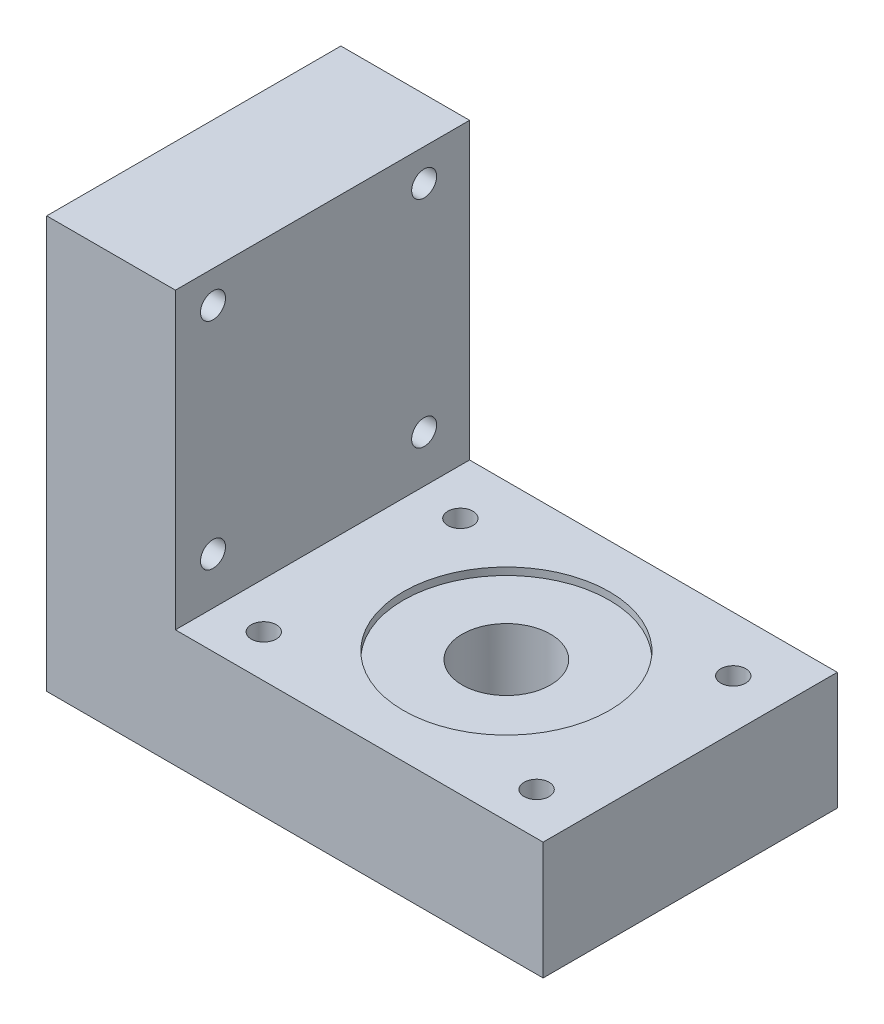
ISO-10303-21;
HEADER;
FILE_DESCRIPTION(('STEP AP214'),'2;1');
FILE_NAME('part.step','',(''),(''),'','','');
FILE_SCHEMA(('AUTOMOTIVE_DESIGN { 1 0 10303 214 1 1 1 1 }'));
ENDSEC;
DATA;
#1=APPLICATION_CONTEXT('core data for automotive mechanical design processes');
#2=APPLICATION_PROTOCOL_DEFINITION('international standard','automotive_design',2000,#1);
#3=PRODUCT_CONTEXT('',#1,'mechanical');
#4=PRODUCT('Part','Part','',(#3));
#5=PRODUCT_RELATED_PRODUCT_CATEGORY('part','',(#4));
#6=PRODUCT_DEFINITION_FORMATION('','',#4);
#7=PRODUCT_DEFINITION_CONTEXT('part definition',#1,'design');
#8=PRODUCT_DEFINITION('design','',#6,#7);
#9=PRODUCT_DEFINITION_SHAPE('','',#8);
#10=(LENGTH_UNIT() NAMED_UNIT(*) SI_UNIT(.MILLI.,.METRE.));
#11=(NAMED_UNIT(*) PLANE_ANGLE_UNIT() SI_UNIT($,.RADIAN.));
#12=(NAMED_UNIT(*) SI_UNIT($,.STERADIAN.) SOLID_ANGLE_UNIT());
#13=UNCERTAINTY_MEASURE_WITH_UNIT(LENGTH_MEASURE(1.E-05),#10,'distance_accuracy_value','');
#14=(GEOMETRIC_REPRESENTATION_CONTEXT(3) GLOBAL_UNCERTAINTY_ASSIGNED_CONTEXT((#13)) GLOBAL_UNIT_ASSIGNED_CONTEXT((#10,
#11,#12)) REPRESENTATION_CONTEXT('',''));
#15=CARTESIAN_POINT('',(0.,0.,0.));
#16=DIRECTION('',(0.,0.,1.));
#17=DIRECTION('',(1.,0.,0.));
#18=AXIS2_PLACEMENT_3D('',#15,#16,#17);
#19=CARTESIAN_POINT('',(42500.,-0.0009999999992516,20000.));
#20=DIRECTION('',(0.,1.,0.));
#21=DIRECTION('',(0.,0.,1.));
#22=AXIS2_PLACEMENT_3D('',#19,#20,#21);
#23=CYLINDRICAL_SURFACE('',#22,6000.);
#24=CARTESIAN_POINT('',(42500.,0.,20000.));
#25=DIRECTION('',(0.,1.,0.));
#26=DIRECTION('',(0.,0.,1.));
#27=AXIS2_PLACEMENT_3D('',#24,#25,#26);
#28=CIRCLE('',#27,6000.);
#29=CARTESIAN_POINT('',(42500.,0.,26000.));
#30=VERTEX_POINT('',#29);
#31=EDGE_CURVE('E132',#30,#30,#28,.F.);
#32=ORIENTED_EDGE('',*,*,#31,.T.);
#33=EDGE_LOOP('',(#32));
#34=FACE_BOUND('',#33,.T.);
#35=CARTESIAN_POINT('',(42500.,15000.,20000.));
#36=DIRECTION('',(0.,1.,0.));
#37=DIRECTION('',(-1.,0.,0.));
#38=AXIS2_PLACEMENT_3D('',#35,#36,#37);
#39=CIRCLE('',#38,6000.);
#40=CARTESIAN_POINT('',(36500.,15000.,20000.));
#41=VERTEX_POINT('',#40);
#42=EDGE_CURVE('E50',#41,#41,#39,.F.);
#43=ORIENTED_EDGE('',*,*,#42,.F.);
#44=EDGE_LOOP('',(#43));
#45=FACE_BOUND('',#44,.T.);
#46=ADVANCED_FACE('F43',(#34,#45),#23,.F.);
#47=CARTESIAN_POINT('',(17500.,56000.,40000.));
#48=DIRECTION('',(0.,-1.,0.));
#49=DIRECTION('',(0.,0.,-1.));
#50=AXIS2_PLACEMENT_3D('',#47,#48,#49);
#51=PLANE('',#50);
#52=DIRECTION('',(-1.,0.,0.));
#53=VECTOR('',#52,1.);
#54=CARTESIAN_POINT('',(17500.,56000.,0.));
#55=LINE('',#54,#53);
#56=CARTESIAN_POINT('',(17500.,56000.,0.));
#57=VERTEX_POINT('',#56);
#58=CARTESIAN_POINT('',(-1.95943487863576E-12,56000.,0.));
#59=VERTEX_POINT('',#58);
#60=EDGE_CURVE('E129',#57,#59,#55,.T.);
#61=ORIENTED_EDGE('',*,*,#60,.T.);
#62=DIRECTION('',(0.,0.,-1.));
#63=VECTOR('',#62,1.);
#64=CARTESIAN_POINT('',(-1.95943487863576E-12,56000.,40000.));
#65=LINE('',#64,#63);
#66=CARTESIAN_POINT('',(-1.95943487863576E-12,56000.,40000.));
#67=VERTEX_POINT('',#66);
#68=EDGE_CURVE('E11',#67,#59,#65,.T.);
#69=ORIENTED_EDGE('',*,*,#68,.F.);
#70=DIRECTION('',(-1.,0.,0.));
#71=VECTOR('',#70,1.);
#72=CARTESIAN_POINT('',(17500.,56000.,40000.));
#73=LINE('',#72,#71);
#74=CARTESIAN_POINT('',(17500.,56000.,40000.));
#75=VERTEX_POINT('',#74);
#76=EDGE_CURVE('E138',#75,#67,#73,.T.);
#77=ORIENTED_EDGE('',*,*,#76,.F.);
#78=DIRECTION('',(0.,0.,-1.));
#79=VECTOR('',#78,1.);
#80=CARTESIAN_POINT('',(17500.,56000.,40000.));
#81=LINE('',#80,#79);
#82=EDGE_CURVE('E123',#75,#57,#81,.T.);
#83=ORIENTED_EDGE('',*,*,#82,.T.);
#84=EDGE_LOOP('',(#61,#69,#77,#83));
#85=FACE_BOUND('',#84,.T.);
#86=ADVANCED_FACE('F44',(#85),#51,.F.);
#87=CARTESIAN_POINT('',(-1.95943487863576E-12,56000.,40000.));
#88=DIRECTION('',(1.,0.,0.));
#89=DIRECTION('',(0.,1.,0.));
#90=AXIS2_PLACEMENT_3D('',#87,#88,#89);
#91=PLANE('',#90);
#92=CARTESIAN_POINT('',(-1.80748762955245E-12,51657.3945870796,6177.40458756636));
#93=DIRECTION('',(1.,0.,0.));
#94=DIRECTION('',(0.,1.,0.));
#95=AXIS2_PLACEMENT_3D('',#92,#93,#94);
#96=CIRCLE('',#95,1700.);
#97=CARTESIAN_POINT('',(-1.86697047408247E-12,53357.3945870796,6177.40458756636));
#98=VERTEX_POINT('',#97);
#99=EDGE_CURVE('E266',#98,#98,#96,.F.);
#100=ORIENTED_EDGE('',*,*,#99,.F.);
#101=EDGE_LOOP('',(#100));
#102=FACE_BOUND('',#101,.T.);
#103=CARTESIAN_POINT('',(-7.82974810068773E-13,22377.1581320959,34887.5833416566));
#104=DIRECTION('',(1.,0.,0.));
#105=DIRECTION('',(0.,1.,0.));
#106=AXIS2_PLACEMENT_3D('',#103,#104,#105);
#107=CIRCLE('',#106,1700.00000000001);
#108=CARTESIAN_POINT('',(-8.42457654598787E-13,24077.1581320959,34887.5833416566));
#109=VERTEX_POINT('',#108);
#110=EDGE_CURVE('E269',#109,#109,#107,.F.);
#111=ORIENTED_EDGE('',*,*,#110,.F.);
#112=EDGE_LOOP('',(#111));
#113=FACE_BOUND('',#112,.T.);
#114=CARTESIAN_POINT('',(-7.82974810068773E-13,22377.1581320959,6177.40458756636));
#115=DIRECTION('',(1.,0.,0.));
#116=DIRECTION('',(0.,1.,0.));
#117=AXIS2_PLACEMENT_3D('',#114,#115,#116);
#118=CIRCLE('',#117,1700.);
#119=CARTESIAN_POINT('',(-8.42457654598787E-13,24077.1581320959,6177.40458756636));
#120=VERTEX_POINT('',#119);
#121=EDGE_CURVE('E273',#120,#120,#118,.F.);
#122=ORIENTED_EDGE('',*,*,#121,.F.);
#123=EDGE_LOOP('',(#122));
#124=FACE_BOUND('',#123,.T.);
#125=CARTESIAN_POINT('',(-1.80748762955245E-12,51657.3945870796,34887.5833416566));
#126=DIRECTION('',(1.,0.,0.));
#127=DIRECTION('',(0.,1.,0.));
#128=AXIS2_PLACEMENT_3D('',#125,#126,#127);
#129=CIRCLE('',#128,1700.00000000001);
#130=CARTESIAN_POINT('',(-1.86697047408247E-12,53357.3945870796,34887.5833416566));
#131=VERTEX_POINT('',#130);
#132=EDGE_CURVE('E228',#131,#131,#129,.F.);
#133=ORIENTED_EDGE('',*,*,#132,.F.);
#134=EDGE_LOOP('',(#133));
#135=FACE_BOUND('',#134,.T.);
#136=DIRECTION('',(0.,-1.,0.));
#137=VECTOR('',#136,1.);
#138=CARTESIAN_POINT('',(-1.95943487863576E-12,56000.,0.));
#139=LINE('',#138,#137);
#140=CARTESIAN_POINT('',(0.,0.,0.));
#141=VERTEX_POINT('',#140);
#142=EDGE_CURVE('E135',#59,#141,#139,.T.);
#143=ORIENTED_EDGE('',*,*,#142,.T.);
#144=DIRECTION('',(0.,0.,-1.));
#145=VECTOR('',#144,1.);
#146=CARTESIAN_POINT('',(0.,0.,40000.));
#147=LINE('',#146,#145);
#148=CARTESIAN_POINT('',(0.,0.,40000.));
#149=VERTEX_POINT('',#148);
#150=EDGE_CURVE('E52',#149,#141,#147,.T.);
#151=ORIENTED_EDGE('',*,*,#150,.F.);
#152=DIRECTION('',(0.,-1.,0.));
#153=VECTOR('',#152,1.);
#154=CARTESIAN_POINT('',(-1.95943487863576E-12,56000.,40000.));
#155=LINE('',#154,#153);
#156=EDGE_CURVE('E98',#67,#149,#155,.T.);
#157=ORIENTED_EDGE('',*,*,#156,.F.);
#158=ORIENTED_EDGE('',*,*,#68,.T.);
#159=EDGE_LOOP('',(#143,#151,#157,#158));
#160=FACE_BOUND('',#159,.T.);
#161=ADVANCED_FACE('F180',(#102,#113,#124,#135,#160),#91,.F.);
#162=CARTESIAN_POINT('',(0.,0.,40000.));
#163=DIRECTION('',(0.,1.,0.));
#164=DIRECTION('',(0.,0.,1.));
#165=AXIS2_PLACEMENT_3D('',#162,#163,#164);
#166=PLANE('',#165);
#167=CARTESIAN_POINT('',(23750.,0.,34236.0811248548));
#168=DIRECTION('',(0.,1.,0.));
#169=DIRECTION('',(0.,0.,1.));
#170=AXIS2_PLACEMENT_3D('',#167,#168,#169);
#171=CIRCLE('',#170,1700.);
#172=CARTESIAN_POINT('',(23750.,0.,35936.0811248548));
#173=VERTEX_POINT('',#172);
#174=EDGE_CURVE('E225',#173,#173,#171,.F.);
#175=ORIENTED_EDGE('',*,*,#174,.F.);
#176=EDGE_LOOP('',(#175));
#177=FACE_BOUND('',#176,.T.);
#178=CARTESIAN_POINT('',(60851.2734340815,0.,34236.0811248548));
#179=DIRECTION('',(0.,1.,0.));
#180=DIRECTION('',(0.,0.,1.));
#181=AXIS2_PLACEMENT_3D('',#178,#179,#180);
#182=CIRCLE('',#181,1700.00000000001);
#183=CARTESIAN_POINT('',(60851.2734340815,0.,35936.0811248548));
#184=VERTEX_POINT('',#183);
#185=EDGE_CURVE('E214',#184,#184,#182,.F.);
#186=ORIENTED_EDGE('',*,*,#185,.F.);
#187=EDGE_LOOP('',(#186));
#188=FACE_BOUND('',#187,.T.);
#189=CARTESIAN_POINT('',(60851.2734340815,0.,7500.));
#190=DIRECTION('',(0.,1.,0.));
#191=DIRECTION('',(0.,0.,1.));
#192=AXIS2_PLACEMENT_3D('',#189,#190,#191);
#193=CIRCLE('',#192,1700.00000000001);
#194=CARTESIAN_POINT('',(60851.2734340815,0.,9200.00000000001));
#195=VERTEX_POINT('',#194);
#196=EDGE_CURVE('E218',#195,#195,#193,.F.);
#197=ORIENTED_EDGE('',*,*,#196,.F.);
#198=EDGE_LOOP('',(#197));
#199=FACE_BOUND('',#198,.T.);
#200=CARTESIAN_POINT('',(23750.,0.,7500.));
#201=DIRECTION('',(0.,1.,0.));
#202=DIRECTION('',(0.,0.,1.));
#203=AXIS2_PLACEMENT_3D('',#200,#201,#202);
#204=CIRCLE('',#203,1700.);
#205=CARTESIAN_POINT('',(23750.,0.,9200.));
#206=VERTEX_POINT('',#205);
#207=EDGE_CURVE('E233',#206,#206,#204,.F.);
#208=ORIENTED_EDGE('',*,*,#207,.F.);
#209=EDGE_LOOP('',(#208));
#210=FACE_BOUND('',#209,.T.);
#211=ORIENTED_EDGE('',*,*,#31,.F.);
#212=EDGE_LOOP('',(#211));
#213=FACE_BOUND('',#212,.T.);
#214=DIRECTION('',(1.,0.,0.));
#215=VECTOR('',#214,1.);
#216=CARTESIAN_POINT('',(0.,0.,0.));
#217=LINE('',#216,#215);
#218=CARTESIAN_POINT('',(67500.,0.,0.));
#219=VERTEX_POINT('',#218);
#220=EDGE_CURVE('E134',#141,#219,#217,.T.);
#221=ORIENTED_EDGE('',*,*,#220,.T.);
#222=DIRECTION('',(0.,0.,-1.));
#223=VECTOR('',#222,1.);
#224=CARTESIAN_POINT('',(67500.,0.,40000.));
#225=LINE('',#224,#223);
#226=CARTESIAN_POINT('',(67500.,0.,40000.));
#227=VERTEX_POINT('',#226);
#228=EDGE_CURVE('E119',#227,#219,#225,.T.);
#229=ORIENTED_EDGE('',*,*,#228,.F.);
#230=DIRECTION('',(1.,0.,0.));
#231=VECTOR('',#230,1.);
#232=CARTESIAN_POINT('',(0.,0.,40000.));
#233=LINE('',#232,#231);
#234=EDGE_CURVE('E112',#149,#227,#233,.T.);
#235=ORIENTED_EDGE('',*,*,#234,.F.);
#236=ORIENTED_EDGE('',*,*,#150,.T.);
#237=EDGE_LOOP('',(#221,#229,#235,#236));
#238=FACE_BOUND('',#237,.T.);
#239=ADVANCED_FACE('F150',(#177,#188,#199,#210,#213,#238),#166,.F.);
#240=CARTESIAN_POINT('',(67500.,0.,40000.));
#241=DIRECTION('',(-1.,0.,0.));
#242=DIRECTION('',(0.,0.,1.));
#243=AXIS2_PLACEMENT_3D('',#240,#241,#242);
#244=PLANE('',#243);
#245=DIRECTION('',(0.,1.,0.));
#246=VECTOR('',#245,1.);
#247=CARTESIAN_POINT('',(67500.,0.,0.));
#248=LINE('',#247,#246);
#249=CARTESIAN_POINT('',(67500.,16000.,0.));
#250=VERTEX_POINT('',#249);
#251=EDGE_CURVE('E118',#219,#250,#248,.T.);
#252=ORIENTED_EDGE('',*,*,#251,.T.);
#253=DIRECTION('',(0.,0.,-1.));
#254=VECTOR('',#253,1.);
#255=CARTESIAN_POINT('',(67500.,16000.,40000.));
#256=LINE('',#255,#254);
#257=CARTESIAN_POINT('',(67500.,16000.,40000.));
#258=VERTEX_POINT('',#257);
#259=EDGE_CURVE('E116',#258,#250,#256,.T.);
#260=ORIENTED_EDGE('',*,*,#259,.F.);
#261=DIRECTION('',(0.,1.,0.));
#262=VECTOR('',#261,1.);
#263=CARTESIAN_POINT('',(67500.,0.,40000.));
#264=LINE('',#263,#262);
#265=EDGE_CURVE('E104',#227,#258,#264,.T.);
#266=ORIENTED_EDGE('',*,*,#265,.F.);
#267=ORIENTED_EDGE('',*,*,#228,.T.);
#268=EDGE_LOOP('',(#252,#260,#266,#267));
#269=FACE_BOUND('',#268,.T.);
#270=ADVANCED_FACE('F120',(#269),#244,.F.);
#271=CARTESIAN_POINT('',(67500.,16000.,40000.));
#272=DIRECTION('',(0.,-1.,0.));
#273=DIRECTION('',(1.,0.,0.));
#274=AXIS2_PLACEMENT_3D('',#271,#272,#273);
#275=PLANE('',#274);
#276=CARTESIAN_POINT('',(42500.,16000.,20000.));
#277=DIRECTION('',(0.,1.,0.));
#278=DIRECTION('',(-1.,0.,0.));
#279=AXIS2_PLACEMENT_3D('',#276,#277,#278);
#280=CIRCLE('',#279,14000.);
#281=CARTESIAN_POINT('',(28500.,16000.,20000.));
#282=VERTEX_POINT('',#281);
#283=EDGE_CURVE('E294',#282,#282,#280,.T.);
#284=ORIENTED_EDGE('',*,*,#283,.F.);
#285=EDGE_LOOP('',(#284));
#286=FACE_BOUND('',#285,.T.);
#287=CARTESIAN_POINT('',(23750.,16000.,34236.0811248548));
#288=DIRECTION('',(0.,1.,0.));
#289=DIRECTION('',(-1.,0.,0.));
#290=AXIS2_PLACEMENT_3D('',#287,#288,#289);
#291=CIRCLE('',#290,1700.);
#292=CARTESIAN_POINT('',(22050.,16000.,34236.0811248548));
#293=VERTEX_POINT('',#292);
#294=EDGE_CURVE('E220',#293,#293,#291,.T.);
#295=ORIENTED_EDGE('',*,*,#294,.F.);
#296=EDGE_LOOP('',(#295));
#297=FACE_BOUND('',#296,.T.);
#298=CARTESIAN_POINT('',(60851.2734340815,16000.,34236.0811248548));
#299=DIRECTION('',(0.,1.,0.));
#300=DIRECTION('',(-1.,0.,0.));
#301=AXIS2_PLACEMENT_3D('',#298,#299,#300);
#302=CIRCLE('',#301,1700.00000000001);
#303=CARTESIAN_POINT('',(59151.2734340815,16000.,34236.0811248548));
#304=VERTEX_POINT('',#303);
#305=EDGE_CURVE('E215',#304,#304,#302,.T.);
#306=ORIENTED_EDGE('',*,*,#305,.F.);
#307=EDGE_LOOP('',(#306));
#308=FACE_BOUND('',#307,.T.);
#309=CARTESIAN_POINT('',(60851.2734340815,16000.,7500.));
#310=DIRECTION('',(0.,1.,0.));
#311=DIRECTION('',(-1.,0.,0.));
#312=AXIS2_PLACEMENT_3D('',#309,#310,#311);
#313=CIRCLE('',#312,1700.00000000001);
#314=CARTESIAN_POINT('',(59151.2734340815,16000.,7500.));
#315=VERTEX_POINT('',#314);
#316=EDGE_CURVE('E223',#315,#315,#313,.T.);
#317=ORIENTED_EDGE('',*,*,#316,.F.);
#318=EDGE_LOOP('',(#317));
#319=FACE_BOUND('',#318,.T.);
#320=CARTESIAN_POINT('',(23750.,16000.,7500.));
#321=DIRECTION('',(0.,1.,0.));
#322=DIRECTION('',(-1.,0.,0.));
#323=AXIS2_PLACEMENT_3D('',#320,#321,#322);
#324=CIRCLE('',#323,1700.);
#325=CARTESIAN_POINT('',(22050.,16000.,7500.));
#326=VERTEX_POINT('',#325);
#327=EDGE_CURVE('E235',#326,#326,#324,.T.);
#328=ORIENTED_EDGE('',*,*,#327,.F.);
#329=EDGE_LOOP('',(#328));
#330=FACE_BOUND('',#329,.T.);
#331=DIRECTION('',(-1.,0.,0.));
#332=VECTOR('',#331,1.);
#333=CARTESIAN_POINT('',(67500.,16000.,0.));
#334=LINE('',#333,#332);
#335=CARTESIAN_POINT('',(17500.,16000.,0.));
#336=VERTEX_POINT('',#335);
#337=EDGE_CURVE('E81',#250,#336,#334,.T.);
#338=ORIENTED_EDGE('',*,*,#337,.T.);
#339=DIRECTION('',(0.,0.,-1.));
#340=VECTOR('',#339,1.);
#341=CARTESIAN_POINT('',(17500.,16000.,40000.));
#342=LINE('',#341,#340);
#343=CARTESIAN_POINT('',(17500.,16000.,40000.));
#344=VERTEX_POINT('',#343);
#345=EDGE_CURVE('E122',#344,#336,#342,.T.);
#346=ORIENTED_EDGE('',*,*,#345,.F.);
#347=DIRECTION('',(-1.,0.,0.));
#348=VECTOR('',#347,1.);
#349=CARTESIAN_POINT('',(67500.,16000.,40000.));
#350=LINE('',#349,#348);
#351=EDGE_CURVE('E108',#258,#344,#350,.T.);
#352=ORIENTED_EDGE('',*,*,#351,.F.);
#353=ORIENTED_EDGE('',*,*,#259,.T.);
#354=EDGE_LOOP('',(#338,#346,#352,#353));
#355=FACE_BOUND('',#354,.T.);
#356=ADVANCED_FACE('F124',(#286,#297,#308,#319,#330,#355),#275,.F.);
#357=CARTESIAN_POINT('',(17500.,16000.,40000.));
#358=DIRECTION('',(-1.,0.,0.));
#359=DIRECTION('',(0.,-1.,0.));
#360=AXIS2_PLACEMENT_3D('',#357,#358,#359);
#361=PLANE('',#360);
#362=CARTESIAN_POINT('',(17500.,51657.3945870796,6177.40458756636));
#363=DIRECTION('',(1.,0.,0.));
#364=DIRECTION('',(0.,1.,0.));
#365=AXIS2_PLACEMENT_3D('',#362,#363,#364);
#366=CIRCLE('',#365,1700.);
#367=CARTESIAN_POINT('',(17500.,53357.3945870796,6177.40458756636));
#368=VERTEX_POINT('',#367);
#369=EDGE_CURVE('E278',#368,#368,#366,.T.);
#370=ORIENTED_EDGE('',*,*,#369,.F.);
#371=EDGE_LOOP('',(#370));
#372=FACE_BOUND('',#371,.T.);
#373=CARTESIAN_POINT('',(17500.,22377.1581320959,34887.5833416566));
#374=DIRECTION('',(1.,0.,0.));
#375=DIRECTION('',(0.,1.,0.));
#376=AXIS2_PLACEMENT_3D('',#373,#374,#375);
#377=CIRCLE('',#376,1700.00000000001);
#378=CARTESIAN_POINT('',(17500.,24077.1581320959,34887.5833416566));
#379=VERTEX_POINT('',#378);
#380=EDGE_CURVE('E282',#379,#379,#377,.T.);
#381=ORIENTED_EDGE('',*,*,#380,.F.);
#382=EDGE_LOOP('',(#381));
#383=FACE_BOUND('',#382,.T.);
#384=CARTESIAN_POINT('',(17500.,22377.1581320959,6177.40458756636));
#385=DIRECTION('',(1.,0.,0.));
#386=DIRECTION('',(0.,1.,0.));
#387=AXIS2_PLACEMENT_3D('',#384,#385,#386);
#388=CIRCLE('',#387,1700.);
#389=CARTESIAN_POINT('',(17500.,24077.1581320959,6177.40458756636));
#390=VERTEX_POINT('',#389);
#391=EDGE_CURVE('E290',#390,#390,#388,.T.);
#392=ORIENTED_EDGE('',*,*,#391,.F.);
#393=EDGE_LOOP('',(#392));
#394=FACE_BOUND('',#393,.T.);
#395=CARTESIAN_POINT('',(17500.,51657.3945870796,34887.5833416566));
#396=DIRECTION('',(1.,0.,0.));
#397=DIRECTION('',(0.,1.,0.));
#398=AXIS2_PLACEMENT_3D('',#395,#396,#397);
#399=CIRCLE('',#398,1700.00000000001);
#400=CARTESIAN_POINT('',(17500.,53357.3945870796,34887.5833416566));
#401=VERTEX_POINT('',#400);
#402=EDGE_CURVE('E279',#401,#401,#399,.T.);
#403=ORIENTED_EDGE('',*,*,#402,.F.);
#404=EDGE_LOOP('',(#403));
#405=FACE_BOUND('',#404,.T.);
#406=DIRECTION('',(0.,1.,0.));
#407=VECTOR('',#406,1.);
#408=CARTESIAN_POINT('',(17500.,16000.,0.));
#409=LINE('',#408,#407);
#410=EDGE_CURVE('E89',#336,#57,#409,.T.);
#411=ORIENTED_EDGE('',*,*,#410,.T.);
#412=ORIENTED_EDGE('',*,*,#82,.F.);
#413=DIRECTION('',(0.,1.,0.));
#414=VECTOR('',#413,1.);
#415=CARTESIAN_POINT('',(17500.,16000.,40000.));
#416=LINE('',#415,#414);
#417=EDGE_CURVE('E61',#344,#75,#416,.T.);
#418=ORIENTED_EDGE('',*,*,#417,.F.);
#419=ORIENTED_EDGE('',*,*,#345,.T.);
#420=EDGE_LOOP('',(#411,#412,#418,#419));
#421=FACE_BOUND('',#420,.T.);
#422=ADVANCED_FACE('F152',(#372,#383,#394,#405,#421),#361,.F.);
#423=CARTESIAN_POINT('',(0.,0.,40000.));
#424=DIRECTION('',(0.,0.,1.));
#425=DIRECTION('',(1.,0.,0.));
#426=AXIS2_PLACEMENT_3D('',#423,#424,#425);
#427=PLANE('',#426);
#428=ORIENTED_EDGE('',*,*,#76,.T.);
#429=ORIENTED_EDGE('',*,*,#156,.T.);
#430=ORIENTED_EDGE('',*,*,#234,.T.);
#431=ORIENTED_EDGE('',*,*,#265,.T.);
#432=ORIENTED_EDGE('',*,*,#351,.T.);
#433=ORIENTED_EDGE('',*,*,#417,.T.);
#434=EDGE_LOOP('',(#428,#429,#430,#431,#432,#433));
#435=FACE_BOUND('',#434,.T.);
#436=ADVANCED_FACE('F110',(#435),#427,.T.);
#437=CARTESIAN_POINT('',(0.,0.,0.));
#438=DIRECTION('',(0.,0.,1.));
#439=DIRECTION('',(1.,0.,0.));
#440=AXIS2_PLACEMENT_3D('',#437,#438,#439);
#441=PLANE('',#440);
#442=ORIENTED_EDGE('',*,*,#60,.F.);
#443=ORIENTED_EDGE('',*,*,#410,.F.);
#444=ORIENTED_EDGE('',*,*,#337,.F.);
#445=ORIENTED_EDGE('',*,*,#251,.F.);
#446=ORIENTED_EDGE('',*,*,#220,.F.);
#447=ORIENTED_EDGE('',*,*,#142,.F.);
#448=EDGE_LOOP('',(#442,#443,#444,#445,#446,#447));
#449=FACE_BOUND('',#448,.T.);
#450=ADVANCED_FACE('F147',(#449),#441,.F.);
#451=CARTESIAN_POINT('',(23750.,-0.00100000000280431,7500.));
#452=DIRECTION('',(0.,1.,0.));
#453=DIRECTION('',(0.,0.,1.));
#454=AXIS2_PLACEMENT_3D('',#451,#452,#453);
#455=CYLINDRICAL_SURFACE('',#454,1700.);
#456=ORIENTED_EDGE('',*,*,#327,.T.);
#457=EDGE_LOOP('',(#456));
#458=FACE_BOUND('',#457,.T.);
#459=ORIENTED_EDGE('',*,*,#207,.T.);
#460=EDGE_LOOP('',(#459));
#461=FACE_BOUND('',#460,.T.);
#462=ADVANCED_FACE('F184',(#458,#461),#455,.F.);
#463=CARTESIAN_POINT('',(60851.2734340815,-0.000999999995698886,7500.));
#464=DIRECTION('',(0.,1.,0.));
#465=DIRECTION('',(0.,0.,1.));
#466=AXIS2_PLACEMENT_3D('',#463,#464,#465);
#467=CYLINDRICAL_SURFACE('',#466,1700.00000000001);
#468=ORIENTED_EDGE('',*,*,#316,.T.);
#469=EDGE_LOOP('',(#468));
#470=FACE_BOUND('',#469,.T.);
#471=ORIENTED_EDGE('',*,*,#196,.T.);
#472=EDGE_LOOP('',(#471));
#473=FACE_BOUND('',#472,.T.);
#474=ADVANCED_FACE('F188',(#470,#473),#467,.F.);
#475=CARTESIAN_POINT('',(60851.2734340815,-0.000999999995698886,34236.0811248548));
#476=DIRECTION('',(0.,1.,0.));
#477=DIRECTION('',(0.,0.,1.));
#478=AXIS2_PLACEMENT_3D('',#475,#476,#477);
#479=CYLINDRICAL_SURFACE('',#478,1700.00000000001);
#480=ORIENTED_EDGE('',*,*,#305,.T.);
#481=EDGE_LOOP('',(#480));
#482=FACE_BOUND('',#481,.T.);
#483=ORIENTED_EDGE('',*,*,#185,.T.);
#484=EDGE_LOOP('',(#483));
#485=FACE_BOUND('',#484,.T.);
#486=ADVANCED_FACE('F193',(#482,#485),#479,.F.);
#487=CARTESIAN_POINT('',(23750.,-0.00100000000280431,34236.0811248548));
#488=DIRECTION('',(0.,1.,0.));
#489=DIRECTION('',(0.,0.,1.));
#490=AXIS2_PLACEMENT_3D('',#487,#488,#489);
#491=CYLINDRICAL_SURFACE('',#490,1700.);
#492=ORIENTED_EDGE('',*,*,#294,.T.);
#493=EDGE_LOOP('',(#492));
#494=FACE_BOUND('',#493,.T.);
#495=ORIENTED_EDGE('',*,*,#174,.T.);
#496=EDGE_LOOP('',(#495));
#497=FACE_BOUND('',#496,.T.);
#498=ADVANCED_FACE('F182',(#494,#497),#491,.F.);
#499=CARTESIAN_POINT('',(-0.00100000000458067,51657.3945870796,34887.5833416566));
#500=DIRECTION('',(1.,0.,0.));
#501=DIRECTION('',(0.,1.,0.));
#502=AXIS2_PLACEMENT_3D('',#499,#500,#501);
#503=CYLINDRICAL_SURFACE('',#502,1700.00000000001);
#504=ORIENTED_EDGE('',*,*,#402,.T.);
#505=EDGE_LOOP('',(#504));
#506=FACE_BOUND('',#505,.T.);
#507=ORIENTED_EDGE('',*,*,#132,.T.);
#508=EDGE_LOOP('',(#507));
#509=FACE_BOUND('',#508,.T.);
#510=ADVANCED_FACE('F203',(#506,#509),#503,.F.);
#511=CARTESIAN_POINT('',(-0.00100000000458067,22377.1581320959,6177.40458756636));
#512=DIRECTION('',(1.,0.,0.));
#513=DIRECTION('',(0.,1.,0.));
#514=AXIS2_PLACEMENT_3D('',#511,#512,#513);
#515=CYLINDRICAL_SURFACE('',#514,1700.);
#516=ORIENTED_EDGE('',*,*,#391,.T.);
#517=EDGE_LOOP('',(#516));
#518=FACE_BOUND('',#517,.T.);
#519=ORIENTED_EDGE('',*,*,#121,.T.);
#520=EDGE_LOOP('',(#519));
#521=FACE_BOUND('',#520,.T.);
#522=ADVANCED_FACE('F318',(#518,#521),#515,.F.);
#523=CARTESIAN_POINT('',(-0.00100000000458067,22377.1581320959,34887.5833416566));
#524=DIRECTION('',(1.,0.,0.));
#525=DIRECTION('',(0.,1.,0.));
#526=AXIS2_PLACEMENT_3D('',#523,#524,#525);
#527=CYLINDRICAL_SURFACE('',#526,1700.00000000001);
#528=ORIENTED_EDGE('',*,*,#380,.T.);
#529=EDGE_LOOP('',(#528));
#530=FACE_BOUND('',#529,.T.);
#531=ORIENTED_EDGE('',*,*,#110,.T.);
#532=EDGE_LOOP('',(#531));
#533=FACE_BOUND('',#532,.T.);
#534=ADVANCED_FACE('F314',(#530,#533),#527,.F.);
#535=CARTESIAN_POINT('',(-0.00100000000458067,51657.3945870796,6177.40458756636));
#536=DIRECTION('',(1.,0.,0.));
#537=DIRECTION('',(0.,1.,0.));
#538=AXIS2_PLACEMENT_3D('',#535,#536,#537);
#539=CYLINDRICAL_SURFACE('',#538,1700.);
#540=ORIENTED_EDGE('',*,*,#369,.T.);
#541=EDGE_LOOP('',(#540));
#542=FACE_BOUND('',#541,.T.);
#543=ORIENTED_EDGE('',*,*,#99,.T.);
#544=EDGE_LOOP('',(#543));
#545=FACE_BOUND('',#544,.T.);
#546=ADVANCED_FACE('F307',(#542,#545),#539,.F.);
#547=CARTESIAN_POINT('',(42500.,15000.,20000.));
#548=DIRECTION('',(0.,1.,0.));
#549=DIRECTION('',(-1.,0.,0.));
#550=AXIS2_PLACEMENT_3D('',#547,#548,#549);
#551=PLANE('',#550);
#552=CARTESIAN_POINT('',(42500.,15000.,20000.));
#553=DIRECTION('',(0.,1.,0.));
#554=DIRECTION('',(-1.,0.,0.));
#555=AXIS2_PLACEMENT_3D('',#552,#553,#554);
#556=CIRCLE('',#555,14000.);
#557=CARTESIAN_POINT('',(28500.,15000.,20000.));
#558=VERTEX_POINT('',#557);
#559=EDGE_CURVE('E300',#558,#558,#556,.T.);
#560=ORIENTED_EDGE('',*,*,#559,.T.);
#561=EDGE_LOOP('',(#560));
#562=FACE_BOUND('',#561,.T.);
#563=ORIENTED_EDGE('',*,*,#42,.T.);
#564=EDGE_LOOP('',(#563));
#565=FACE_BOUND('',#564,.T.);
#566=ADVANCED_FACE('F301',(#562,#565),#551,.T.);
#567=CARTESIAN_POINT('',(42500.,15000.,20000.));
#568=DIRECTION('',(0.,1.,0.));
#569=DIRECTION('',(-1.,0.,0.));
#570=AXIS2_PLACEMENT_3D('',#567,#568,#569);
#571=CYLINDRICAL_SURFACE('',#570,14000.);
#572=ORIENTED_EDGE('',*,*,#559,.F.);
#573=EDGE_LOOP('',(#572));
#574=FACE_BOUND('',#573,.T.);
#575=ORIENTED_EDGE('',*,*,#283,.T.);
#576=EDGE_LOOP('',(#575));
#577=FACE_BOUND('',#576,.T.);
#578=ADVANCED_FACE('F308',(#574,#577),#571,.F.);
#579=CLOSED_SHELL('',(#46,#86,#161,#239,#270,#356,#422,#436,#450,#462,#474,#486,#498,#510,#522,
#534,#546,#566,#578));
#580=MANIFOLD_SOLID_BREP('B2',#579);
#581=ADVANCED_BREP_SHAPE_REPRESENTATION('',(#18,#580),#14);
#582=SHAPE_DEFINITION_REPRESENTATION(#9,#581);
ENDSEC;
END-ISO-10303-21;
